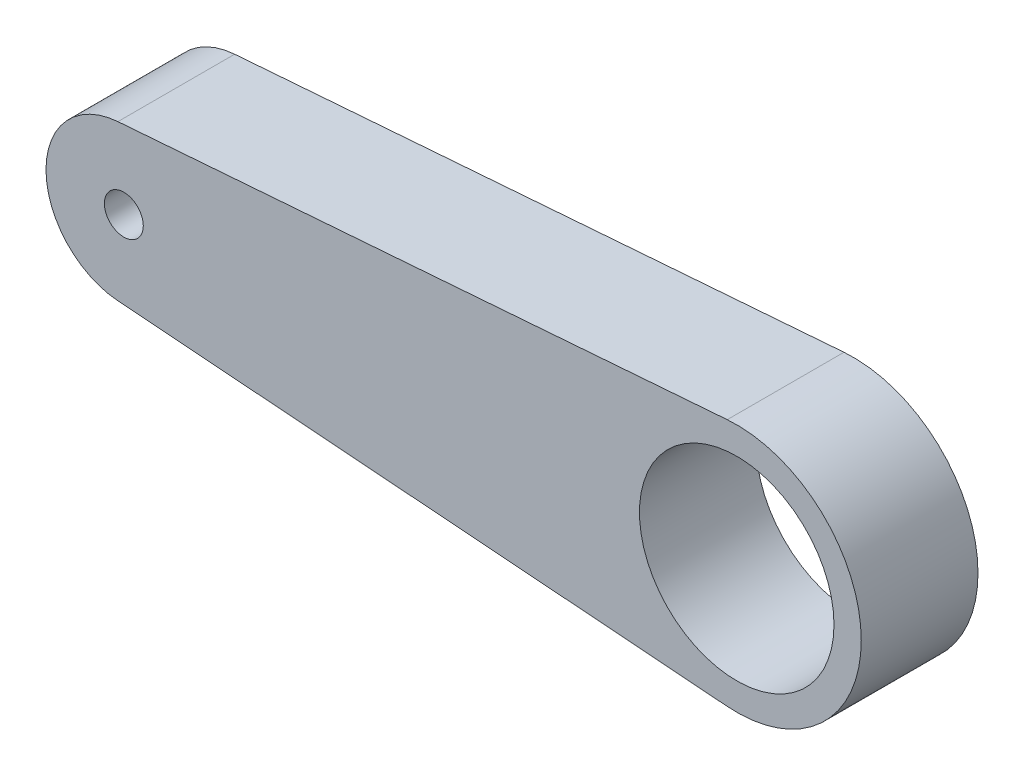
ISO-10303-21;
HEADER;
FILE_DESCRIPTION(('STEP AP214'),'2;1');
FILE_NAME('part.step','',(''),(''),'','','');
FILE_SCHEMA(('AUTOMOTIVE_DESIGN { 1 0 10303 214 1 1 1 1 }'));
ENDSEC;
DATA;
#1=APPLICATION_CONTEXT('core data for automotive mechanical design processes');
#2=APPLICATION_PROTOCOL_DEFINITION('international standard','automotive_design',2000,#1);
#3=PRODUCT_CONTEXT('',#1,'mechanical');
#4=PRODUCT('Part','Part','',(#3));
#5=PRODUCT_RELATED_PRODUCT_CATEGORY('part','',(#4));
#6=PRODUCT_DEFINITION_FORMATION('','',#4);
#7=PRODUCT_DEFINITION_CONTEXT('part definition',#1,'design');
#8=PRODUCT_DEFINITION('design','',#6,#7);
#9=PRODUCT_DEFINITION_SHAPE('','',#8);
#10=(LENGTH_UNIT() NAMED_UNIT(*) SI_UNIT(.MILLI.,.METRE.));
#11=(NAMED_UNIT(*) PLANE_ANGLE_UNIT() SI_UNIT($,.RADIAN.));
#12=(NAMED_UNIT(*) SI_UNIT($,.STERADIAN.) SOLID_ANGLE_UNIT());
#13=UNCERTAINTY_MEASURE_WITH_UNIT(LENGTH_MEASURE(1.E-05),#10,'distance_accuracy_value','');
#14=(GEOMETRIC_REPRESENTATION_CONTEXT(3) GLOBAL_UNCERTAINTY_ASSIGNED_CONTEXT((#13)) GLOBAL_UNIT_ASSIGNED_CONTEXT((#10,
#11,#12)) REPRESENTATION_CONTEXT('',''));
#15=CARTESIAN_POINT('',(0.,0.,0.));
#16=DIRECTION('',(0.,0.,1.));
#17=DIRECTION('',(1.,0.,0.));
#18=AXIS2_PLACEMENT_3D('',#15,#16,#17);
#19=CARTESIAN_POINT('',(0.,0.,1.5));
#20=DIRECTION('',(0.,0.,1.));
#21=DIRECTION('',(1.,0.,0.));
#22=AXIS2_PLACEMENT_3D('',#19,#20,#21);
#23=PLANE('',#22);
#24=CARTESIAN_POINT('',(0.,0.,1.5));
#25=DIRECTION('',(0.,0.,1.));
#26=DIRECTION('',(1.,0.,0.));
#27=AXIS2_PLACEMENT_3D('',#24,#25,#26);
#28=CIRCLE('',#27,0.5);
#29=CARTESIAN_POINT('',(0.5,0.,1.5));
#30=VERTEX_POINT('',#29);
#31=EDGE_CURVE('E113',#30,#30,#28,.T.);
#32=ORIENTED_EDGE('',*,*,#31,.F.);
#33=EDGE_LOOP('',(#32));
#34=FACE_BOUND('',#33,.T.);
#35=DIRECTION('',(0.997093281161732,-0.0761904761904762,0.));
#36=VECTOR('',#35,1.);
#37=CARTESIAN_POINT('',(-0.152380952380952,-1.99418656232346,1.5));
#38=LINE('',#37,#36);
#39=CARTESIAN_POINT('',(-0.152380952380952,-1.99418656232346,1.5));
#40=VERTEX_POINT('',#39);
#41=CARTESIAN_POINT('',(15.5061904761905,-3.19069849971754,1.5));
#42=VERTEX_POINT('',#41);
#43=EDGE_CURVE('E102',#40,#42,#38,.T.);
#44=ORIENTED_EDGE('',*,*,#43,.T.);
#45=CARTESIAN_POINT('',(15.75,0.,1.5));
#46=DIRECTION('',(0.,0.,1.));
#47=DIRECTION('',(1.,0.,0.));
#48=AXIS2_PLACEMENT_3D('',#45,#46,#47);
#49=CIRCLE('',#48,3.2);
#50=CARTESIAN_POINT('',(15.5061904761905,3.19069849971754,1.5));
#51=VERTEX_POINT('',#50);
#52=EDGE_CURVE('E97',#42,#51,#49,.T.);
#53=ORIENTED_EDGE('',*,*,#52,.T.);
#54=DIRECTION('',(0.997093281161732,0.0761904761904762,0.));
#55=VECTOR('',#54,1.);
#56=CARTESIAN_POINT('',(-0.152380952380952,1.99418656232346,1.5));
#57=LINE('',#56,#55);
#58=CARTESIAN_POINT('',(-0.152380952380952,1.99418656232346,1.5));
#59=VERTEX_POINT('',#58);
#60=EDGE_CURVE('E100',#59,#51,#57,.T.);
#61=ORIENTED_EDGE('',*,*,#60,.F.);
#62=CARTESIAN_POINT('',(0.,0.,1.5));
#63=DIRECTION('',(0.,0.,1.));
#64=DIRECTION('',(1.,0.,0.));
#65=AXIS2_PLACEMENT_3D('',#62,#63,#64);
#66=CIRCLE('',#65,2.);
#67=EDGE_CURVE('E71',#59,#40,#66,.T.);
#68=ORIENTED_EDGE('',*,*,#67,.T.);
#69=EDGE_LOOP('',(#44,#53,#61,#68));
#70=FACE_BOUND('',#69,.T.);
#71=CARTESIAN_POINT('',(15.75,0.,1.5));
#72=DIRECTION('',(0.,0.,1.));
#73=DIRECTION('',(1.,0.,0.));
#74=AXIS2_PLACEMENT_3D('',#71,#72,#73);
#75=CIRCLE('',#74,2.5);
#76=CARTESIAN_POINT('',(18.25,0.,1.5));
#77=VERTEX_POINT('',#76);
#78=EDGE_CURVE('E123',#77,#77,#75,.T.);
#79=ORIENTED_EDGE('',*,*,#78,.F.);
#80=EDGE_LOOP('',(#79));
#81=FACE_BOUND('',#80,.T.);
#82=ADVANCED_FACE('F54',(#34,#70,#81),#23,.T.);
#83=CARTESIAN_POINT('',(0.,0.,-1.5));
#84=DIRECTION('',(0.,0.,1.));
#85=DIRECTION('',(1.,0.,0.));
#86=AXIS2_PLACEMENT_3D('',#83,#84,#85);
#87=PLANE('',#86);
#88=DIRECTION('',(0.997093281161732,-0.0761904761904762,0.));
#89=VECTOR('',#88,1.);
#90=CARTESIAN_POINT('',(-0.152380952380952,-1.99418656232346,-1.5));
#91=LINE('',#90,#89);
#92=CARTESIAN_POINT('',(-0.152380952380952,-1.99418656232346,-1.5));
#93=VERTEX_POINT('',#92);
#94=CARTESIAN_POINT('',(15.5061904761905,-3.19069849971754,-1.5));
#95=VERTEX_POINT('',#94);
#96=EDGE_CURVE('E120',#93,#95,#91,.T.);
#97=ORIENTED_EDGE('',*,*,#96,.F.);
#98=CARTESIAN_POINT('',(0.,0.,-1.5));
#99=DIRECTION('',(0.,0.,1.));
#100=DIRECTION('',(1.,0.,0.));
#101=AXIS2_PLACEMENT_3D('',#98,#99,#100);
#102=CIRCLE('',#101,2.);
#103=CARTESIAN_POINT('',(-0.152380952380952,1.99418656232346,-1.5));
#104=VERTEX_POINT('',#103);
#105=EDGE_CURVE('E90',#104,#93,#102,.T.);
#106=ORIENTED_EDGE('',*,*,#105,.F.);
#107=DIRECTION('',(0.997093281161732,0.0761904761904762,0.));
#108=VECTOR('',#107,1.);
#109=CARTESIAN_POINT('',(-0.152380952380952,1.99418656232346,-1.5));
#110=LINE('',#109,#108);
#111=CARTESIAN_POINT('',(15.5061904761905,3.19069849971754,-1.5));
#112=VERTEX_POINT('',#111);
#113=EDGE_CURVE('E125',#104,#112,#110,.T.);
#114=ORIENTED_EDGE('',*,*,#113,.T.);
#115=CARTESIAN_POINT('',(15.75,0.,-1.5));
#116=DIRECTION('',(0.,0.,1.));
#117=DIRECTION('',(1.,0.,0.));
#118=AXIS2_PLACEMENT_3D('',#115,#116,#117);
#119=CIRCLE('',#118,3.2);
#120=EDGE_CURVE('E107',#95,#112,#119,.T.);
#121=ORIENTED_EDGE('',*,*,#120,.F.);
#122=EDGE_LOOP('',(#97,#106,#114,#121));
#123=FACE_BOUND('',#122,.T.);
#124=CARTESIAN_POINT('',(0.,0.,-1.5));
#125=DIRECTION('',(0.,0.,1.));
#126=DIRECTION('',(1.,0.,0.));
#127=AXIS2_PLACEMENT_3D('',#124,#125,#126);
#128=CIRCLE('',#127,0.5);
#129=CARTESIAN_POINT('',(0.5,0.,-1.5));
#130=VERTEX_POINT('',#129);
#131=EDGE_CURVE('E128',#130,#130,#128,.T.);
#132=ORIENTED_EDGE('',*,*,#131,.T.);
#133=EDGE_LOOP('',(#132));
#134=FACE_BOUND('',#133,.T.);
#135=CARTESIAN_POINT('',(15.75,0.,-1.5));
#136=DIRECTION('',(0.,0.,1.));
#137=DIRECTION('',(1.,0.,0.));
#138=AXIS2_PLACEMENT_3D('',#135,#136,#137);
#139=CIRCLE('',#138,2.5);
#140=CARTESIAN_POINT('',(18.25,0.,-1.5));
#141=VERTEX_POINT('',#140);
#142=EDGE_CURVE('E143',#141,#141,#139,.T.);
#143=ORIENTED_EDGE('',*,*,#142,.T.);
#144=EDGE_LOOP('',(#143));
#145=FACE_BOUND('',#144,.T.);
#146=ADVANCED_FACE('F135',(#123,#134,#145),#87,.F.);
#147=CARTESIAN_POINT('',(-0.152380952380952,-1.99418656232346,1.5));
#148=DIRECTION('',(0.0761904761904762,0.997093281161732,0.));
#149=DIRECTION('',(-0.997093281161732,0.0761904761904762,0.));
#150=AXIS2_PLACEMENT_3D('',#147,#148,#149);
#151=PLANE('',#150);
#152=ORIENTED_EDGE('',*,*,#96,.T.);
#153=DIRECTION('',(0.,0.,-1.));
#154=VECTOR('',#153,1.);
#155=CARTESIAN_POINT('',(15.5061904761905,-3.19069849971754,1.5));
#156=LINE('',#155,#154);
#157=EDGE_CURVE('E12',#42,#95,#156,.T.);
#158=ORIENTED_EDGE('',*,*,#157,.F.);
#159=ORIENTED_EDGE('',*,*,#43,.F.);
#160=DIRECTION('',(0.,0.,-1.));
#161=VECTOR('',#160,1.);
#162=CARTESIAN_POINT('',(-0.152380952380952,-1.99418656232346,1.5));
#163=LINE('',#162,#161);
#164=EDGE_CURVE('E119',#40,#93,#163,.T.);
#165=ORIENTED_EDGE('',*,*,#164,.T.);
#166=EDGE_LOOP('',(#152,#158,#159,#165));
#167=FACE_BOUND('',#166,.T.);
#168=ADVANCED_FACE('F56',(#167),#151,.F.);
#169=CARTESIAN_POINT('',(15.75,0.,1.5));
#170=DIRECTION('',(0.,0.,-1.));
#171=DIRECTION('',(-1.,0.,0.));
#172=AXIS2_PLACEMENT_3D('',#169,#170,#171);
#173=CYLINDRICAL_SURFACE('',#172,3.2);
#174=ORIENTED_EDGE('',*,*,#120,.T.);
#175=DIRECTION('',(0.,0.,-1.));
#176=VECTOR('',#175,1.);
#177=CARTESIAN_POINT('',(15.5061904761905,3.19069849971754,1.5));
#178=LINE('',#177,#176);
#179=EDGE_CURVE('E63',#51,#112,#178,.T.);
#180=ORIENTED_EDGE('',*,*,#179,.F.);
#181=ORIENTED_EDGE('',*,*,#52,.F.);
#182=ORIENTED_EDGE('',*,*,#157,.T.);
#183=EDGE_LOOP('',(#174,#180,#181,#182));
#184=FACE_BOUND('',#183,.T.);
#185=ADVANCED_FACE('F106',(#184),#173,.T.);
#186=CARTESIAN_POINT('',(-0.152380952380952,1.99418656232346,1.5));
#187=DIRECTION('',(-0.0761904761904762,0.997093281161732,0.));
#188=DIRECTION('',(-0.997093281161732,-0.0761904761904762,0.));
#189=AXIS2_PLACEMENT_3D('',#186,#187,#188);
#190=PLANE('',#189);
#191=ORIENTED_EDGE('',*,*,#113,.F.);
#192=DIRECTION('',(0.,0.,-1.));
#193=VECTOR('',#192,1.);
#194=CARTESIAN_POINT('',(-0.152380952380952,1.99418656232346,1.5));
#195=LINE('',#194,#193);
#196=EDGE_CURVE('E87',#59,#104,#195,.T.);
#197=ORIENTED_EDGE('',*,*,#196,.F.);
#198=ORIENTED_EDGE('',*,*,#60,.T.);
#199=ORIENTED_EDGE('',*,*,#179,.T.);
#200=EDGE_LOOP('',(#191,#197,#198,#199));
#201=FACE_BOUND('',#200,.T.);
#202=ADVANCED_FACE('F111',(#201),#190,.T.);
#203=CARTESIAN_POINT('',(0.,0.,1.5));
#204=DIRECTION('',(0.,0.,-1.));
#205=DIRECTION('',(-1.,0.,0.));
#206=AXIS2_PLACEMENT_3D('',#203,#204,#205);
#207=CYLINDRICAL_SURFACE('',#206,2.);
#208=ORIENTED_EDGE('',*,*,#105,.T.);
#209=ORIENTED_EDGE('',*,*,#164,.F.);
#210=ORIENTED_EDGE('',*,*,#67,.F.);
#211=ORIENTED_EDGE('',*,*,#196,.T.);
#212=EDGE_LOOP('',(#208,#209,#210,#211));
#213=FACE_BOUND('',#212,.T.);
#214=ADVANCED_FACE('F162',(#213),#207,.T.);
#215=CARTESIAN_POINT('',(0.,0.,1.5));
#216=DIRECTION('',(0.,0.,-1.));
#217=DIRECTION('',(-1.,0.,0.));
#218=AXIS2_PLACEMENT_3D('',#215,#216,#217);
#219=CYLINDRICAL_SURFACE('',#218,0.5);
#220=ORIENTED_EDGE('',*,*,#31,.T.);
#221=EDGE_LOOP('',(#220));
#222=FACE_BOUND('',#221,.T.);
#223=ORIENTED_EDGE('',*,*,#131,.F.);
#224=EDGE_LOOP('',(#223));
#225=FACE_BOUND('',#224,.T.);
#226=ADVANCED_FACE('F159',(#222,#225),#219,.F.);
#227=CARTESIAN_POINT('',(15.75,0.,1.5));
#228=DIRECTION('',(0.,0.,-1.));
#229=DIRECTION('',(-1.,0.,0.));
#230=AXIS2_PLACEMENT_3D('',#227,#228,#229);
#231=CYLINDRICAL_SURFACE('',#230,2.5);
#232=ORIENTED_EDGE('',*,*,#78,.T.);
#233=EDGE_LOOP('',(#232));
#234=FACE_BOUND('',#233,.T.);
#235=ORIENTED_EDGE('',*,*,#142,.F.);
#236=EDGE_LOOP('',(#235));
#237=FACE_BOUND('',#236,.T.);
#238=ADVANCED_FACE('F150',(#234,#237),#231,.F.);
#239=CLOSED_SHELL('',(#82,#146,#168,#185,#202,#214,#226,#238));
#240=MANIFOLD_SOLID_BREP('B2',#239);
#241=ADVANCED_BREP_SHAPE_REPRESENTATION('',(#18,#240),#14);
#242=SHAPE_DEFINITION_REPRESENTATION(#9,#241);
ENDSEC;
END-ISO-10303-21;
